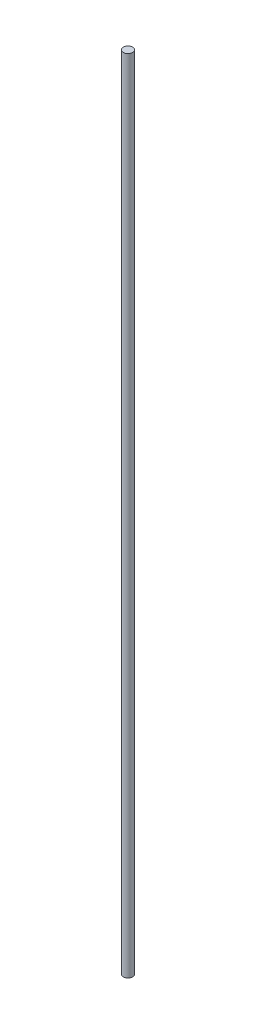
ISO-10303-21;
HEADER;
FILE_DESCRIPTION(('STEP AP214'),'2;1');
FILE_NAME('part.step','',(''),(''),'','','');
FILE_SCHEMA(('AUTOMOTIVE_DESIGN { 1 0 10303 214 1 1 1 1 }'));
ENDSEC;
DATA;
#1=APPLICATION_CONTEXT('core data for automotive mechanical design processes');
#2=APPLICATION_PROTOCOL_DEFINITION('international standard','automotive_design',2000,#1);
#3=PRODUCT_CONTEXT('',#1,'mechanical');
#4=PRODUCT('Part','Part','',(#3));
#5=PRODUCT_RELATED_PRODUCT_CATEGORY('part','',(#4));
#6=PRODUCT_DEFINITION_FORMATION('','',#4);
#7=PRODUCT_DEFINITION_CONTEXT('part definition',#1,'design');
#8=PRODUCT_DEFINITION('design','',#6,#7);
#9=PRODUCT_DEFINITION_SHAPE('','',#8);
#10=(LENGTH_UNIT() NAMED_UNIT(*) SI_UNIT(.MILLI.,.METRE.));
#11=(NAMED_UNIT(*) PLANE_ANGLE_UNIT() SI_UNIT($,.RADIAN.));
#12=(NAMED_UNIT(*) SI_UNIT($,.STERADIAN.) SOLID_ANGLE_UNIT());
#13=UNCERTAINTY_MEASURE_WITH_UNIT(LENGTH_MEASURE(1.E-05),#10,'distance_accuracy_value','');
#14=(GEOMETRIC_REPRESENTATION_CONTEXT(3) GLOBAL_UNCERTAINTY_ASSIGNED_CONTEXT((#13)) GLOBAL_UNIT_ASSIGNED_CONTEXT((#10,
#11,#12)) REPRESENTATION_CONTEXT('',''));
#15=CARTESIAN_POINT('',(0.,0.,0.));
#16=DIRECTION('',(0.,0.,1.));
#17=DIRECTION('',(1.,0.,0.));
#18=AXIS2_PLACEMENT_3D('',#15,#16,#17);
#19=CARTESIAN_POINT('',(0.,344.,0.));
#20=DIRECTION('',(0.,-1.,0.));
#21=DIRECTION('',(0.,0.,-1.));
#22=AXIS2_PLACEMENT_3D('',#19,#20,#21);
#23=CYLINDRICAL_SURFACE('',#22,2.);
#24=CARTESIAN_POINT('',(0.,344.,0.));
#25=DIRECTION('',(0.,1.,0.));
#26=DIRECTION('',(0.,0.,1.));
#27=AXIS2_PLACEMENT_3D('',#24,#25,#26);
#28=CIRCLE('',#27,2.);
#29=CARTESIAN_POINT('',(0.,344.,2.));
#30=VERTEX_POINT('',#29);
#31=EDGE_CURVE('E10',#30,#30,#28,.T.);
#32=ORIENTED_EDGE('',*,*,#31,.F.);
#33=EDGE_LOOP('',(#32));
#34=FACE_BOUND('',#33,.T.);
#35=CARTESIAN_POINT('',(0.,0.,0.));
#36=DIRECTION('',(0.,1.,0.));
#37=DIRECTION('',(0.,0.,1.));
#38=AXIS2_PLACEMENT_3D('',#35,#36,#37);
#39=CIRCLE('',#38,2.);
#40=CARTESIAN_POINT('',(0.,0.,2.));
#41=VERTEX_POINT('',#40);
#42=EDGE_CURVE('E40',#41,#41,#39,.T.);
#43=ORIENTED_EDGE('',*,*,#42,.T.);
#44=EDGE_LOOP('',(#43));
#45=FACE_BOUND('',#44,.T.);
#46=ADVANCED_FACE('F37',(#34,#45),#23,.T.);
#47=CARTESIAN_POINT('',(0.,344.,0.));
#48=DIRECTION('',(0.,1.,0.));
#49=DIRECTION('',(0.,0.,1.));
#50=AXIS2_PLACEMENT_3D('',#47,#48,#49);
#51=PLANE('',#50);
#52=ORIENTED_EDGE('',*,*,#31,.T.);
#53=EDGE_LOOP('',(#52));
#54=FACE_BOUND('',#53,.T.);
#55=ADVANCED_FACE('F52',(#54),#51,.T.);
#56=CARTESIAN_POINT('',(0.,0.,0.));
#57=DIRECTION('',(0.,1.,0.));
#58=DIRECTION('',(0.,0.,1.));
#59=AXIS2_PLACEMENT_3D('',#56,#57,#58);
#60=PLANE('',#59);
#61=ORIENTED_EDGE('',*,*,#42,.F.);
#62=EDGE_LOOP('',(#61));
#63=FACE_BOUND('',#62,.T.);
#64=ADVANCED_FACE('F50',(#63),#60,.F.);
#65=CLOSED_SHELL('',(#46,#55,#64));
#66=MANIFOLD_SOLID_BREP('B2',#65);
#67=ADVANCED_BREP_SHAPE_REPRESENTATION('',(#18,#66),#14);
#68=SHAPE_DEFINITION_REPRESENTATION(#9,#67);
ENDSEC;
END-ISO-10303-21;
